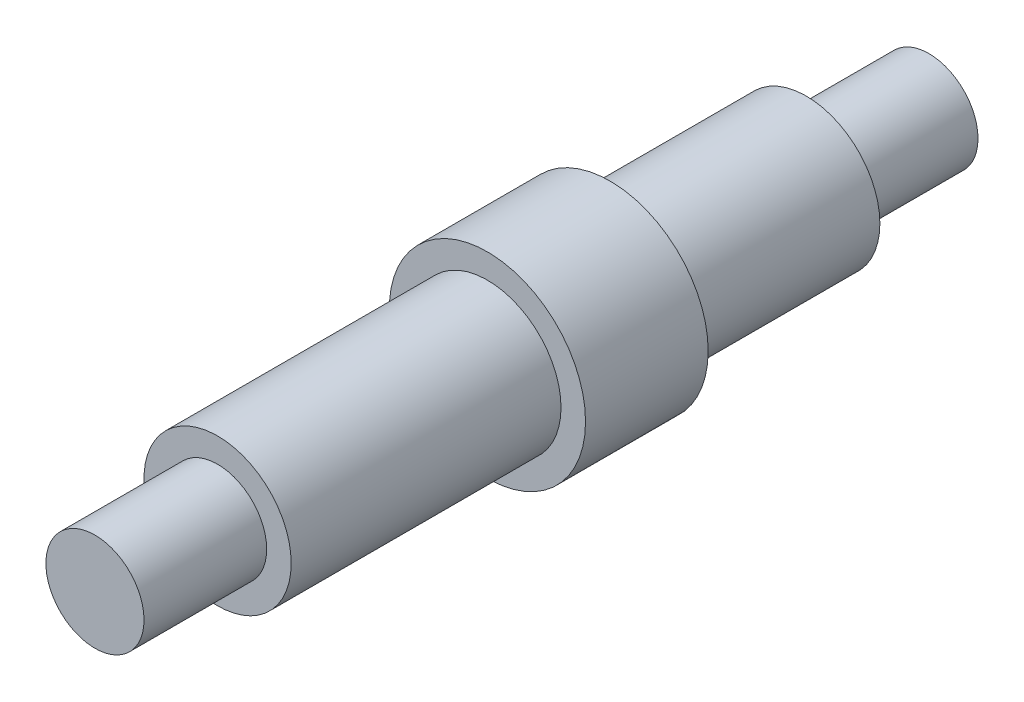
ISO-10303-21;
HEADER;
FILE_DESCRIPTION(('STEP AP214'),'2;1');
FILE_NAME('part.step','',(''),(''),'','','');
FILE_SCHEMA(('AUTOMOTIVE_DESIGN { 1 0 10303 214 1 1 1 1 }'));
ENDSEC;
DATA;
#1=APPLICATION_CONTEXT('core data for automotive mechanical design processes');
#2=APPLICATION_PROTOCOL_DEFINITION('international standard','automotive_design',2000,#1);
#3=PRODUCT_CONTEXT('',#1,'mechanical');
#4=PRODUCT('Part','Part','',(#3));
#5=PRODUCT_RELATED_PRODUCT_CATEGORY('part','',(#4));
#6=PRODUCT_DEFINITION_FORMATION('','',#4);
#7=PRODUCT_DEFINITION_CONTEXT('part definition',#1,'design');
#8=PRODUCT_DEFINITION('design','',#6,#7);
#9=PRODUCT_DEFINITION_SHAPE('','',#8);
#10=(LENGTH_UNIT() NAMED_UNIT(*) SI_UNIT(.MILLI.,.METRE.));
#11=(NAMED_UNIT(*) PLANE_ANGLE_UNIT() SI_UNIT($,.RADIAN.));
#12=(NAMED_UNIT(*) SI_UNIT($,.STERADIAN.) SOLID_ANGLE_UNIT());
#13=UNCERTAINTY_MEASURE_WITH_UNIT(LENGTH_MEASURE(1.E-05),#10,'distance_accuracy_value','');
#14=(GEOMETRIC_REPRESENTATION_CONTEXT(3) GLOBAL_UNCERTAINTY_ASSIGNED_CONTEXT((#13)) GLOBAL_UNIT_ASSIGNED_CONTEXT((#10,
#11,#12)) REPRESENTATION_CONTEXT('',''));
#15=CARTESIAN_POINT('',(0.,0.,0.));
#16=DIRECTION('',(0.,0.,1.));
#17=DIRECTION('',(1.,0.,0.));
#18=AXIS2_PLACEMENT_3D('',#15,#16,#17);
#19=CARTESIAN_POINT('',(0.,0.,34.));
#20=DIRECTION('',(0.,0.,-1.));
#21=DIRECTION('',(-1.,0.,0.));
#22=AXIS2_PLACEMENT_3D('',#19,#20,#21);
#23=CYLINDRICAL_SURFACE('',#22,2.);
#24=CARTESIAN_POINT('',(0.,0.,29.));
#25=DIRECTION('',(0.,0.,1.));
#26=DIRECTION('',(1.,0.,0.));
#27=AXIS2_PLACEMENT_3D('',#24,#25,#26);
#28=CIRCLE('',#27,2.);
#29=CARTESIAN_POINT('',(2.,0.,29.));
#30=VERTEX_POINT('',#29);
#31=EDGE_CURVE('E45',#30,#30,#28,.T.);
#32=ORIENTED_EDGE('',*,*,#31,.T.);
#33=EDGE_LOOP('',(#32));
#34=FACE_BOUND('',#33,.T.);
#35=CARTESIAN_POINT('',(0.,0.,34.));
#36=DIRECTION('',(0.,0.,1.));
#37=DIRECTION('',(1.,0.,0.));
#38=AXIS2_PLACEMENT_3D('',#35,#36,#37);
#39=CIRCLE('',#38,2.);
#40=CARTESIAN_POINT('',(2.,0.,34.));
#41=VERTEX_POINT('',#40);
#42=EDGE_CURVE('E42',#41,#41,#39,.T.);
#43=ORIENTED_EDGE('',*,*,#42,.F.);
#44=EDGE_LOOP('',(#43));
#45=FACE_BOUND('',#44,.T.);
#46=ADVANCED_FACE('F31',(#34,#45),#23,.T.);
#47=CARTESIAN_POINT('',(0.,0.,34.));
#48=DIRECTION('',(0.,0.,1.));
#49=DIRECTION('',(1.,0.,0.));
#50=AXIS2_PLACEMENT_3D('',#47,#48,#49);
#51=PLANE('',#50);
#52=ORIENTED_EDGE('',*,*,#42,.T.);
#53=EDGE_LOOP('',(#52));
#54=FACE_BOUND('',#53,.T.);
#55=ADVANCED_FACE('F87',(#54),#51,.T.);
#56=CARTESIAN_POINT('',(0.,0.,29.));
#57=DIRECTION('',(0.,0.,-1.));
#58=DIRECTION('',(-1.,0.,0.));
#59=AXIS2_PLACEMENT_3D('',#56,#57,#58);
#60=CYLINDRICAL_SURFACE('',#59,3.);
#61=CARTESIAN_POINT('',(0.,0.,18.));
#62=DIRECTION('',(0.,0.,1.));
#63=DIRECTION('',(1.,0.,0.));
#64=AXIS2_PLACEMENT_3D('',#61,#62,#63);
#65=CIRCLE('',#64,3.);
#66=CARTESIAN_POINT('',(3.,0.,18.));
#67=VERTEX_POINT('',#66);
#68=EDGE_CURVE('E34',#67,#67,#65,.T.);
#69=ORIENTED_EDGE('',*,*,#68,.T.);
#70=EDGE_LOOP('',(#69));
#71=FACE_BOUND('',#70,.T.);
#72=CARTESIAN_POINT('',(0.,0.,29.));
#73=DIRECTION('',(0.,0.,1.));
#74=DIRECTION('',(1.,0.,0.));
#75=AXIS2_PLACEMENT_3D('',#72,#73,#74);
#76=CIRCLE('',#75,3.);
#77=CARTESIAN_POINT('',(3.,0.,29.));
#78=VERTEX_POINT('',#77);
#79=EDGE_CURVE('E48',#78,#78,#76,.T.);
#80=ORIENTED_EDGE('',*,*,#79,.F.);
#81=EDGE_LOOP('',(#80));
#82=FACE_BOUND('',#81,.T.);
#83=ADVANCED_FACE('F69',(#71,#82),#60,.T.);
#84=CARTESIAN_POINT('',(0.,0.,29.));
#85=DIRECTION('',(0.,0.,1.));
#86=DIRECTION('',(1.,0.,0.));
#87=AXIS2_PLACEMENT_3D('',#84,#85,#86);
#88=PLANE('',#87);
#89=ORIENTED_EDGE('',*,*,#31,.F.);
#90=EDGE_LOOP('',(#89));
#91=FACE_BOUND('',#90,.T.);
#92=ORIENTED_EDGE('',*,*,#79,.T.);
#93=EDGE_LOOP('',(#92));
#94=FACE_BOUND('',#93,.T.);
#95=ADVANCED_FACE('F83',(#91,#94),#88,.T.);
#96=CARTESIAN_POINT('',(0.,0.,18.));
#97=DIRECTION('',(0.,0.,-1.));
#98=DIRECTION('',(-1.,0.,0.));
#99=AXIS2_PLACEMENT_3D('',#96,#97,#98);
#100=CYLINDRICAL_SURFACE('',#99,4.);
#101=CARTESIAN_POINT('',(0.,0.,18.));
#102=DIRECTION('',(0.,0.,1.));
#103=DIRECTION('',(1.,0.,0.));
#104=AXIS2_PLACEMENT_3D('',#101,#102,#103);
#105=CIRCLE('',#104,4.);
#106=CARTESIAN_POINT('',(4.,0.,18.));
#107=VERTEX_POINT('',#106);
#108=EDGE_CURVE('E62',#107,#107,#105,.T.);
#109=ORIENTED_EDGE('',*,*,#108,.F.);
#110=EDGE_LOOP('',(#109));
#111=FACE_BOUND('',#110,.T.);
#112=CARTESIAN_POINT('',(0.,0.,13.));
#113=DIRECTION('',(0.,0.,1.));
#114=DIRECTION('',(1.,0.,0.));
#115=AXIS2_PLACEMENT_3D('',#112,#113,#114);
#116=CIRCLE('',#115,4.);
#117=CARTESIAN_POINT('',(4.,0.,13.));
#118=VERTEX_POINT('',#117);
#119=EDGE_CURVE('E59',#118,#118,#116,.T.);
#120=ORIENTED_EDGE('',*,*,#119,.T.);
#121=EDGE_LOOP('',(#120));
#122=FACE_BOUND('',#121,.T.);
#123=ADVANCED_FACE('F75',(#111,#122),#100,.T.);
#124=CARTESIAN_POINT('',(0.,0.,18.));
#125=DIRECTION('',(0.,0.,1.));
#126=DIRECTION('',(1.,0.,0.));
#127=AXIS2_PLACEMENT_3D('',#124,#125,#126);
#128=PLANE('',#127);
#129=ORIENTED_EDGE('',*,*,#68,.F.);
#130=EDGE_LOOP('',(#129));
#131=FACE_BOUND('',#130,.T.);
#132=ORIENTED_EDGE('',*,*,#108,.T.);
#133=EDGE_LOOP('',(#132));
#134=FACE_BOUND('',#133,.T.);
#135=ADVANCED_FACE('F72',(#131,#134),#128,.T.);
#136=CARTESIAN_POINT('',(0.,0.,13.));
#137=DIRECTION('',(0.,0.,1.));
#138=DIRECTION('',(1.,0.,0.));
#139=AXIS2_PLACEMENT_3D('',#136,#137,#138);
#140=PLANE('',#139);
#141=CARTESIAN_POINT('',(0.,0.,13.));
#142=DIRECTION('',(0.,0.,1.));
#143=DIRECTION('',(1.,0.,0.));
#144=AXIS2_PLACEMENT_3D('',#141,#142,#143);
#145=CIRCLE('',#144,3.);
#146=CARTESIAN_POINT('',(3.,0.,13.));
#147=VERTEX_POINT('',#146);
#148=EDGE_CURVE('E10',#147,#147,#145,.T.);
#149=ORIENTED_EDGE('',*,*,#148,.T.);
#150=EDGE_LOOP('',(#149));
#151=FACE_BOUND('',#150,.T.);
#152=ORIENTED_EDGE('',*,*,#119,.F.);
#153=EDGE_LOOP('',(#152));
#154=FACE_BOUND('',#153,.T.);
#155=ADVANCED_FACE('F74',(#151,#154),#140,.F.);
#156=CARTESIAN_POINT('',(0.,0.,0.));
#157=DIRECTION('',(0.,0.,1.));
#158=DIRECTION('',(1.,0.,0.));
#159=AXIS2_PLACEMENT_3D('',#156,#157,#158);
#160=PLANE('',#159);
#161=CARTESIAN_POINT('',(0.,0.,0.));
#162=DIRECTION('',(0.,0.,1.));
#163=DIRECTION('',(1.,0.,0.));
#164=AXIS2_PLACEMENT_3D('',#161,#162,#163);
#165=CIRCLE('',#164,2.);
#166=CARTESIAN_POINT('',(2.,0.,0.));
#167=VERTEX_POINT('',#166);
#168=EDGE_CURVE('E47',#167,#167,#165,.T.);
#169=ORIENTED_EDGE('',*,*,#168,.F.);
#170=EDGE_LOOP('',(#169));
#171=FACE_BOUND('',#170,.T.);
#172=ADVANCED_FACE('F81',(#171),#160,.F.);
#173=ORIENTED_EDGE('',*,*,#168,.T.);
#174=EDGE_LOOP('',(#173));
#175=FACE_BOUND('',#174,.T.);
#176=CARTESIAN_POINT('',(0.,0.,5.));
#177=DIRECTION('',(0.,0.,1.));
#178=DIRECTION('',(1.,0.,0.));
#179=AXIS2_PLACEMENT_3D('',#176,#177,#178);
#180=CIRCLE('',#179,2.);
#181=CARTESIAN_POINT('',(2.,0.,5.));
#182=VERTEX_POINT('',#181);
#183=EDGE_CURVE('E38',#182,#182,#180,.T.);
#184=ORIENTED_EDGE('',*,*,#183,.F.);
#185=EDGE_LOOP('',(#184));
#186=FACE_BOUND('',#185,.T.);
#187=ADVANCED_FACE('F89',(#175,#186),#23,.T.);
#188=CARTESIAN_POINT('',(0.,0.,5.));
#189=DIRECTION('',(0.,0.,1.));
#190=DIRECTION('',(1.,0.,0.));
#191=AXIS2_PLACEMENT_3D('',#188,#189,#190);
#192=PLANE('',#191);
#193=ORIENTED_EDGE('',*,*,#183,.T.);
#194=EDGE_LOOP('',(#193));
#195=FACE_BOUND('',#194,.T.);
#196=CARTESIAN_POINT('',(0.,0.,5.));
#197=DIRECTION('',(0.,0.,1.));
#198=DIRECTION('',(1.,0.,0.));
#199=AXIS2_PLACEMENT_3D('',#196,#197,#198);
#200=CIRCLE('',#199,3.);
#201=CARTESIAN_POINT('',(3.,0.,5.));
#202=VERTEX_POINT('',#201);
#203=EDGE_CURVE('E54',#202,#202,#200,.T.);
#204=ORIENTED_EDGE('',*,*,#203,.F.);
#205=EDGE_LOOP('',(#204));
#206=FACE_BOUND('',#205,.T.);
#207=ADVANCED_FACE('F97',(#195,#206),#192,.F.);
#208=ORIENTED_EDGE('',*,*,#203,.T.);
#209=EDGE_LOOP('',(#208));
#210=FACE_BOUND('',#209,.T.);
#211=ORIENTED_EDGE('',*,*,#148,.F.);
#212=EDGE_LOOP('',(#211));
#213=FACE_BOUND('',#212,.T.);
#214=ADVANCED_FACE('F103',(#210,#213),#60,.T.);
#215=CLOSED_SHELL('',(#46,#55,#83,#95,#123,#135,#155,#172,#187,#207,#214));
#216=MANIFOLD_SOLID_BREP('B2',#215);
#217=ADVANCED_BREP_SHAPE_REPRESENTATION('',(#18,#216),#14);
#218=SHAPE_DEFINITION_REPRESENTATION(#9,#217);
ENDSEC;
END-ISO-10303-21;
